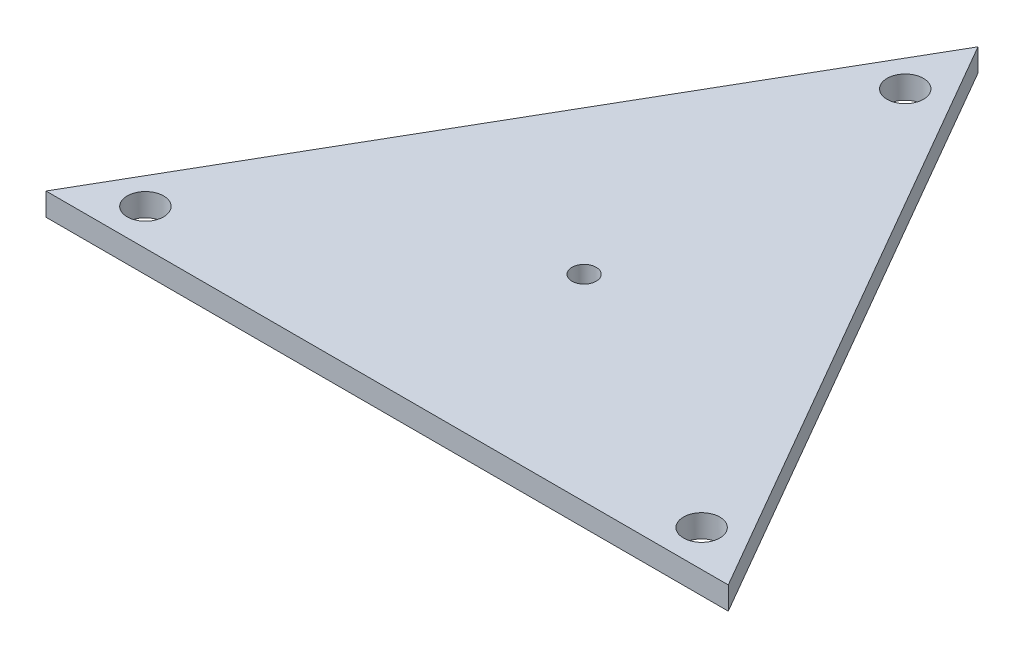
ISO-10303-21;
HEADER;
FILE_DESCRIPTION(('STEP AP214'),'2;1');
FILE_NAME('part.step','',(''),(''),'','','');
FILE_SCHEMA(('AUTOMOTIVE_DESIGN { 1 0 10303 214 1 1 1 1 }'));
ENDSEC;
DATA;
#1=APPLICATION_CONTEXT('core data for automotive mechanical design processes');
#2=APPLICATION_PROTOCOL_DEFINITION('international standard','automotive_design',2000,#1);
#3=PRODUCT_CONTEXT('',#1,'mechanical');
#4=PRODUCT('Part','Part','',(#3));
#5=PRODUCT_RELATED_PRODUCT_CATEGORY('part','',(#4));
#6=PRODUCT_DEFINITION_FORMATION('','',#4);
#7=PRODUCT_DEFINITION_CONTEXT('part definition',#1,'design');
#8=PRODUCT_DEFINITION('design','',#6,#7);
#9=PRODUCT_DEFINITION_SHAPE('','',#8);
#10=(LENGTH_UNIT() NAMED_UNIT(*) SI_UNIT(.MILLI.,.METRE.));
#11=(NAMED_UNIT(*) PLANE_ANGLE_UNIT() SI_UNIT($,.RADIAN.));
#12=(NAMED_UNIT(*) SI_UNIT($,.STERADIAN.) SOLID_ANGLE_UNIT());
#13=UNCERTAINTY_MEASURE_WITH_UNIT(LENGTH_MEASURE(1.E-05),#10,'distance_accuracy_value','');
#14=(GEOMETRIC_REPRESENTATION_CONTEXT(3) GLOBAL_UNCERTAINTY_ASSIGNED_CONTEXT((#13)) GLOBAL_UNIT_ASSIGNED_CONTEXT((#10,
#11,#12)) REPRESENTATION_CONTEXT('',''));
#15=CARTESIAN_POINT('',(0.,0.,0.));
#16=DIRECTION('',(0.,0.,1.));
#17=DIRECTION('',(1.,0.,0.));
#18=AXIS2_PLACEMENT_3D('',#15,#16,#17);
#19=CARTESIAN_POINT('',(-75.,5.,0.));
#20=DIRECTION('',(0.866025403784439,0.,0.5));
#21=DIRECTION('',(0.5,0.,-0.866025403784439));
#22=AXIS2_PLACEMENT_3D('',#19,#20,#21);
#23=PLANE('',#22);
#24=DIRECTION('',(-0.5,0.,0.866025403784439));
#25=VECTOR('',#24,1.);
#26=CARTESIAN_POINT('',(-75.,0.,0.));
#27=LINE('',#26,#25);
#28=CARTESIAN_POINT('',(0.,0.,-129.903810567666));
#29=VERTEX_POINT('',#28);
#30=CARTESIAN_POINT('',(-75.,0.,0.));
#31=VERTEX_POINT('',#30);
#32=EDGE_CURVE('E95',#29,#31,#27,.T.);
#33=ORIENTED_EDGE('',*,*,#32,.T.);
#34=DIRECTION('',(0.,-1.,0.));
#35=VECTOR('',#34,1.);
#36=CARTESIAN_POINT('',(-75.,5.,0.));
#37=LINE('',#36,#35);
#38=CARTESIAN_POINT('',(-75.,5.,0.));
#39=VERTEX_POINT('',#38);
#40=EDGE_CURVE('E11',#39,#31,#37,.T.);
#41=ORIENTED_EDGE('',*,*,#40,.F.);
#42=DIRECTION('',(-0.5,0.,0.866025403784439));
#43=VECTOR('',#42,1.);
#44=CARTESIAN_POINT('',(-75.,5.,0.));
#45=LINE('',#44,#43);
#46=CARTESIAN_POINT('',(0.,5.,-129.903810567666));
#47=VERTEX_POINT('',#46);
#48=EDGE_CURVE('E87',#47,#39,#45,.T.);
#49=ORIENTED_EDGE('',*,*,#48,.F.);
#50=DIRECTION('',(0.,-1.,0.));
#51=VECTOR('',#50,1.);
#52=CARTESIAN_POINT('',(0.,5.,-129.903810567666));
#53=LINE('',#52,#51);
#54=EDGE_CURVE('E96',#47,#29,#53,.T.);
#55=ORIENTED_EDGE('',*,*,#54,.T.);
#56=EDGE_LOOP('',(#33,#41,#49,#55));
#57=FACE_BOUND('',#56,.T.);
#58=ADVANCED_FACE('F45',(#57),#23,.F.);
#59=CARTESIAN_POINT('',(75.,5.,0.));
#60=DIRECTION('',(0.,0.,-1.));
#61=DIRECTION('',(-1.,0.,0.));
#62=AXIS2_PLACEMENT_3D('',#59,#60,#61);
#63=PLANE('',#62);
#64=DIRECTION('',(1.,0.,0.));
#65=VECTOR('',#64,1.);
#66=CARTESIAN_POINT('',(75.,0.,0.));
#67=LINE('',#66,#65);
#68=CARTESIAN_POINT('',(75.,0.,0.));
#69=VERTEX_POINT('',#68);
#70=EDGE_CURVE('E74',#31,#69,#67,.T.);
#71=ORIENTED_EDGE('',*,*,#70,.T.);
#72=DIRECTION('',(0.,-1.,0.));
#73=VECTOR('',#72,1.);
#74=CARTESIAN_POINT('',(75.,5.,0.));
#75=LINE('',#74,#73);
#76=CARTESIAN_POINT('',(75.,5.,0.));
#77=VERTEX_POINT('',#76);
#78=EDGE_CURVE('E54',#77,#69,#75,.T.);
#79=ORIENTED_EDGE('',*,*,#78,.F.);
#80=DIRECTION('',(1.,0.,0.));
#81=VECTOR('',#80,1.);
#82=CARTESIAN_POINT('',(75.,5.,0.));
#83=LINE('',#82,#81);
#84=EDGE_CURVE('E82',#39,#77,#83,.T.);
#85=ORIENTED_EDGE('',*,*,#84,.F.);
#86=ORIENTED_EDGE('',*,*,#40,.T.);
#87=EDGE_LOOP('',(#71,#79,#85,#86));
#88=FACE_BOUND('',#87,.T.);
#89=ADVANCED_FACE('F83',(#88),#63,.F.);
#90=CARTESIAN_POINT('',(0.,5.,-129.903810567666));
#91=DIRECTION('',(-0.866025403784439,0.,0.5));
#92=DIRECTION('',(0.5,0.,0.866025403784439));
#93=AXIS2_PLACEMENT_3D('',#90,#91,#92);
#94=PLANE('',#93);
#95=DIRECTION('',(-0.5,0.,-0.866025403784439));
#96=VECTOR('',#95,1.);
#97=CARTESIAN_POINT('',(0.,0.,-129.903810567666));
#98=LINE('',#97,#96);
#99=EDGE_CURVE('E79',#69,#29,#98,.T.);
#100=ORIENTED_EDGE('',*,*,#99,.T.);
#101=ORIENTED_EDGE('',*,*,#54,.F.);
#102=DIRECTION('',(-0.5,0.,-0.866025403784439));
#103=VECTOR('',#102,1.);
#104=CARTESIAN_POINT('',(0.,5.,-129.903810567666));
#105=LINE('',#104,#103);
#106=EDGE_CURVE('E62',#77,#47,#105,.T.);
#107=ORIENTED_EDGE('',*,*,#106,.F.);
#108=ORIENTED_EDGE('',*,*,#78,.T.);
#109=EDGE_LOOP('',(#100,#101,#107,#108));
#110=FACE_BOUND('',#109,.T.);
#111=ADVANCED_FACE('F113',(#110),#94,.F.);
#112=CARTESIAN_POINT('',(0.,5.,0.));
#113=DIRECTION('',(0.,-1.,0.));
#114=DIRECTION('',(0.,0.,-1.));
#115=AXIS2_PLACEMENT_3D('',#112,#113,#114);
#116=PLANE('',#115);
#117=CARTESIAN_POINT('',(-61.143593539449,5.,-8.));
#118=DIRECTION('',(0.,-1.,0.));
#119=DIRECTION('',(0.,0.,-1.));
#120=AXIS2_PLACEMENT_3D('',#117,#118,#119);
#121=CIRCLE('',#120,4.);
#122=CARTESIAN_POINT('',(-61.143593539449,5.,-12.));
#123=VERTEX_POINT('',#122);
#124=EDGE_CURVE('E99',#123,#123,#121,.T.);
#125=ORIENTED_EDGE('',*,*,#124,.T.);
#126=EDGE_LOOP('',(#125));
#127=FACE_BOUND('',#126,.T.);
#128=CARTESIAN_POINT('',(0.,5.,-43.3012701892219));
#129=DIRECTION('',(0.,-1.,0.));
#130=DIRECTION('',(0.,0.,-1.));
#131=AXIS2_PLACEMENT_3D('',#128,#129,#130);
#132=CIRCLE('',#131,2.66520989540385);
#133=CARTESIAN_POINT('',(0.,5.,-45.9664800846258));
#134=VERTEX_POINT('',#133);
#135=EDGE_CURVE('E105',#134,#134,#132,.T.);
#136=ORIENTED_EDGE('',*,*,#135,.T.);
#137=EDGE_LOOP('',(#136));
#138=FACE_BOUND('',#137,.T.);
#139=CARTESIAN_POINT('',(0.,5.,-113.903810567666));
#140=DIRECTION('',(0.,-1.,0.));
#141=DIRECTION('',(0.,0.,-1.));
#142=AXIS2_PLACEMENT_3D('',#139,#140,#141);
#143=CIRCLE('',#142,4.);
#144=CARTESIAN_POINT('',(0.,5.,-117.903810567666));
#145=VERTEX_POINT('',#144);
#146=EDGE_CURVE('E199',#145,#145,#143,.T.);
#147=ORIENTED_EDGE('',*,*,#146,.T.);
#148=EDGE_LOOP('',(#147));
#149=FACE_BOUND('',#148,.T.);
#150=CARTESIAN_POINT('',(61.143593539449,5.,-8.));
#151=DIRECTION('',(0.,-1.,0.));
#152=DIRECTION('',(0.,0.,-1.));
#153=AXIS2_PLACEMENT_3D('',#150,#151,#152);
#154=CIRCLE('',#153,4.00000000000001);
#155=CARTESIAN_POINT('',(61.143593539449,5.,-12.));
#156=VERTEX_POINT('',#155);
#157=EDGE_CURVE('E202',#156,#156,#154,.T.);
#158=ORIENTED_EDGE('',*,*,#157,.T.);
#159=EDGE_LOOP('',(#158));
#160=FACE_BOUND('',#159,.T.);
#161=ORIENTED_EDGE('',*,*,#48,.T.);
#162=ORIENTED_EDGE('',*,*,#84,.T.);
#163=ORIENTED_EDGE('',*,*,#106,.T.);
#164=EDGE_LOOP('',(#161,#162,#163));
#165=FACE_BOUND('',#164,.T.);
#166=ADVANCED_FACE('F90',(#127,#138,#149,#160,#165),#116,.F.);
#167=CARTESIAN_POINT('',(0.,0.,0.));
#168=DIRECTION('',(0.,-1.,0.));
#169=DIRECTION('',(0.,0.,-1.));
#170=AXIS2_PLACEMENT_3D('',#167,#168,#169);
#171=PLANE('',#170);
#172=CARTESIAN_POINT('',(-61.143593539449,0.,-8.));
#173=DIRECTION('',(0.,1.,0.));
#174=DIRECTION('',(0.,0.,1.));
#175=AXIS2_PLACEMENT_3D('',#172,#173,#174);
#176=CIRCLE('',#175,4.);
#177=CARTESIAN_POINT('',(-61.143593539449,0.,-4.));
#178=VERTEX_POINT('',#177);
#179=EDGE_CURVE('E190',#178,#178,#176,.T.);
#180=ORIENTED_EDGE('',*,*,#179,.T.);
#181=EDGE_LOOP('',(#180));
#182=FACE_BOUND('',#181,.T.);
#183=CARTESIAN_POINT('',(0.,0.,-43.3012701892219));
#184=DIRECTION('',(0.,1.,0.));
#185=DIRECTION('',(0.,0.,1.));
#186=AXIS2_PLACEMENT_3D('',#183,#184,#185);
#187=CIRCLE('',#186,2.66520989540385);
#188=CARTESIAN_POINT('',(0.,0.,-40.6360602938181));
#189=VERTEX_POINT('',#188);
#190=EDGE_CURVE('E218',#189,#189,#187,.T.);
#191=ORIENTED_EDGE('',*,*,#190,.T.);
#192=EDGE_LOOP('',(#191));
#193=FACE_BOUND('',#192,.T.);
#194=CARTESIAN_POINT('',(0.,0.,-113.903810567666));
#195=DIRECTION('',(0.,1.,0.));
#196=DIRECTION('',(0.,0.,1.));
#197=AXIS2_PLACEMENT_3D('',#194,#195,#196);
#198=CIRCLE('',#197,4.);
#199=CARTESIAN_POINT('',(0.,0.,-109.903810567666));
#200=VERTEX_POINT('',#199);
#201=EDGE_CURVE('E212',#200,#200,#198,.T.);
#202=ORIENTED_EDGE('',*,*,#201,.T.);
#203=EDGE_LOOP('',(#202));
#204=FACE_BOUND('',#203,.T.);
#205=CARTESIAN_POINT('',(61.143593539449,0.,-8.));
#206=DIRECTION('',(0.,1.,0.));
#207=DIRECTION('',(0.,0.,1.));
#208=AXIS2_PLACEMENT_3D('',#205,#206,#207);
#209=CIRCLE('',#208,4.00000000000001);
#210=CARTESIAN_POINT('',(61.143593539449,0.,-3.99999999999999));
#211=VERTEX_POINT('',#210);
#212=EDGE_CURVE('E209',#211,#211,#209,.T.);
#213=ORIENTED_EDGE('',*,*,#212,.T.);
#214=EDGE_LOOP('',(#213));
#215=FACE_BOUND('',#214,.T.);
#216=ORIENTED_EDGE('',*,*,#32,.F.);
#217=ORIENTED_EDGE('',*,*,#99,.F.);
#218=ORIENTED_EDGE('',*,*,#70,.F.);
#219=EDGE_LOOP('',(#216,#217,#218));
#220=FACE_BOUND('',#219,.T.);
#221=ADVANCED_FACE('F114',(#182,#193,#204,#215,#220),#171,.T.);
#222=CARTESIAN_POINT('',(61.143593539449,0.,-8.));
#223=DIRECTION('',(0.,1.,0.));
#224=DIRECTION('',(0.,0.,1.));
#225=AXIS2_PLACEMENT_3D('',#222,#223,#224);
#226=CYLINDRICAL_SURFACE('',#225,4.00000000000001);
#227=ORIENTED_EDGE('',*,*,#212,.F.);
#228=EDGE_LOOP('',(#227));
#229=FACE_BOUND('',#228,.T.);
#230=ORIENTED_EDGE('',*,*,#157,.F.);
#231=EDGE_LOOP('',(#230));
#232=FACE_BOUND('',#231,.T.);
#233=ADVANCED_FACE('F116',(#229,#232),#226,.F.);
#234=CARTESIAN_POINT('',(0.,0.,-113.903810567666));
#235=DIRECTION('',(0.,1.,0.));
#236=DIRECTION('',(0.,0.,1.));
#237=AXIS2_PLACEMENT_3D('',#234,#235,#236);
#238=CYLINDRICAL_SURFACE('',#237,4.);
#239=ORIENTED_EDGE('',*,*,#201,.F.);
#240=EDGE_LOOP('',(#239));
#241=FACE_BOUND('',#240,.T.);
#242=ORIENTED_EDGE('',*,*,#146,.F.);
#243=EDGE_LOOP('',(#242));
#244=FACE_BOUND('',#243,.T.);
#245=ADVANCED_FACE('F123',(#241,#244),#238,.F.);
#246=CARTESIAN_POINT('',(0.,0.,-43.3012701892219));
#247=DIRECTION('',(0.,1.,0.));
#248=DIRECTION('',(0.,0.,1.));
#249=AXIS2_PLACEMENT_3D('',#246,#247,#248);
#250=CYLINDRICAL_SURFACE('',#249,2.66520989540385);
#251=ORIENTED_EDGE('',*,*,#190,.F.);
#252=EDGE_LOOP('',(#251));
#253=FACE_BOUND('',#252,.T.);
#254=ORIENTED_EDGE('',*,*,#135,.F.);
#255=EDGE_LOOP('',(#254));
#256=FACE_BOUND('',#255,.T.);
#257=ADVANCED_FACE('F165',(#253,#256),#250,.F.);
#258=CARTESIAN_POINT('',(-61.143593539449,0.,-8.));
#259=DIRECTION('',(0.,1.,0.));
#260=DIRECTION('',(0.,0.,1.));
#261=AXIS2_PLACEMENT_3D('',#258,#259,#260);
#262=CYLINDRICAL_SURFACE('',#261,4.);
#263=ORIENTED_EDGE('',*,*,#179,.F.);
#264=EDGE_LOOP('',(#263));
#265=FACE_BOUND('',#264,.T.);
#266=ORIENTED_EDGE('',*,*,#124,.F.);
#267=EDGE_LOOP('',(#266));
#268=FACE_BOUND('',#267,.T.);
#269=ADVANCED_FACE('F175',(#265,#268),#262,.F.);
#270=CLOSED_SHELL('',(#58,#89,#111,#166,#221,#233,#245,#257,#269));
#271=MANIFOLD_SOLID_BREP('B2',#270);
#272=ADVANCED_BREP_SHAPE_REPRESENTATION('',(#18,#271),#14);
#273=SHAPE_DEFINITION_REPRESENTATION(#9,#272);
ENDSEC;
END-ISO-10303-21;
